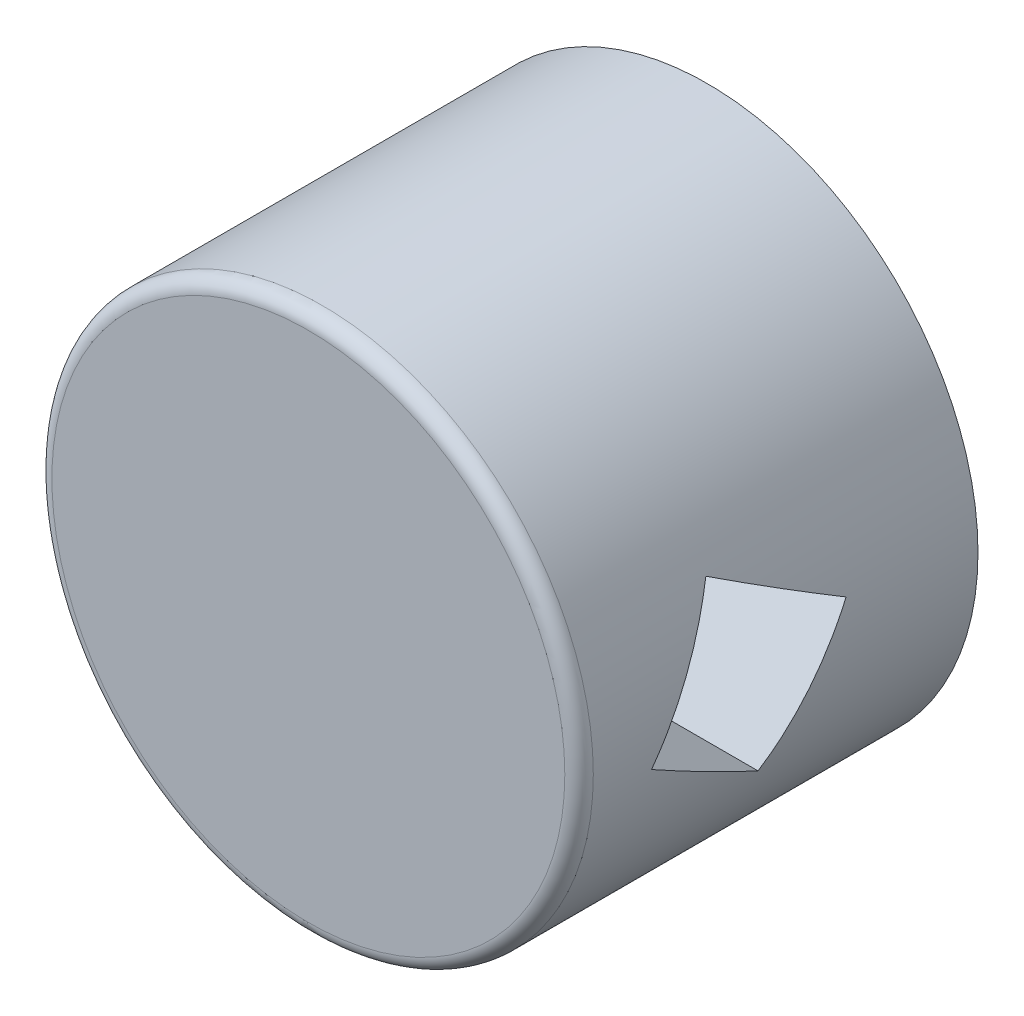
ISO-10303-21;
HEADER;
FILE_DESCRIPTION(('STEP AP214'),'2;1');
FILE_NAME('part.step','',(''),(''),'','','');
FILE_SCHEMA(('AUTOMOTIVE_DESIGN { 1 0 10303 214 1 1 1 1 }'));
ENDSEC;
DATA;
#1=APPLICATION_CONTEXT('core data for automotive mechanical design processes');
#2=APPLICATION_PROTOCOL_DEFINITION('international standard','automotive_design',2000,#1);
#3=PRODUCT_CONTEXT('',#1,'mechanical');
#4=PRODUCT('Part','Part','',(#3));
#5=PRODUCT_RELATED_PRODUCT_CATEGORY('part','',(#4));
#6=PRODUCT_DEFINITION_FORMATION('','',#4);
#7=PRODUCT_DEFINITION_CONTEXT('part definition',#1,'design');
#8=PRODUCT_DEFINITION('design','',#6,#7);
#9=PRODUCT_DEFINITION_SHAPE('','',#8);
#10=(LENGTH_UNIT() NAMED_UNIT(*) SI_UNIT(.MILLI.,.METRE.));
#11=(NAMED_UNIT(*) PLANE_ANGLE_UNIT() SI_UNIT($,.RADIAN.));
#12=(NAMED_UNIT(*) SI_UNIT($,.STERADIAN.) SOLID_ANGLE_UNIT());
#13=UNCERTAINTY_MEASURE_WITH_UNIT(LENGTH_MEASURE(1.E-05),#10,'distance_accuracy_value','');
#14=(GEOMETRIC_REPRESENTATION_CONTEXT(3) GLOBAL_UNCERTAINTY_ASSIGNED_CONTEXT((#13)) GLOBAL_UNIT_ASSIGNED_CONTEXT((#10,
#11,#12)) REPRESENTATION_CONTEXT('',''));
#15=CARTESIAN_POINT('',(0.,0.,0.));
#16=DIRECTION('',(0.,0.,1.));
#17=DIRECTION('',(1.,0.,0.));
#18=AXIS2_PLACEMENT_3D('',#15,#16,#17);
#19=CARTESIAN_POINT('',(0.,0.,70.));
#20=DIRECTION('',(0.,0.,-1.));
#21=DIRECTION('',(-1.,0.,0.));
#22=AXIS2_PLACEMENT_3D('',#19,#20,#21);
#23=CYLINDRICAL_SURFACE('',#22,95.);
#24=CARTESIAN_POINT('',(0.,0.,-40.0000000000002));
#25=DIRECTION('',(0.,0.866025403784442,-0.499999999999995));
#26=DIRECTION('',(0.,-0.499999999999995,-0.866025403784442));
#27=AXIS2_PLACEMENT_3D('',#24,#25,#26);
#28=ELLIPSE('',#27,190.000000000002,95.);
#29=CARTESIAN_POINT('',(-94.5582671021698,9.1506350946107,-24.1506350946114));
#30=VERTEX_POINT('',#29);
#31=CARTESIAN_POINT('',(-88.6495015363018,34.1506350946104,19.1506350946106));
#32=VERTEX_POINT('',#31);
#33=EDGE_CURVE('E11',#30,#32,#28,.T.);
#34=ORIENTED_EDGE('',*,*,#33,.T.);
#35=CARTESIAN_POINT('',(0.,0.,38.8675134594804));
#36=DIRECTION('',(0.,0.499999999999995,0.866025403784442));
#37=DIRECTION('',(0.,0.866025403784442,-0.499999999999995));
#38=AXIS2_PLACEMENT_3D('',#35,#36,#37);
#39=ELLIPSE('',#38,109.696551146029,95.);
#40=CARTESIAN_POINT('',(-94.5582671021697,-9.15063509461164,44.1506350946104));
#41=VERTEX_POINT('',#40);
#42=EDGE_CURVE('E52',#32,#41,#39,.T.);
#43=ORIENTED_EDGE('',*,*,#42,.T.);
#44=CARTESIAN_POINT('',(0.,0.,60.0000000000008));
#45=DIRECTION('',(0.,-0.866025403784442,0.499999999999995));
#46=DIRECTION('',(0.,-0.499999999999995,-0.866025403784442));
#47=AXIS2_PLACEMENT_3D('',#44,#45,#46);
#48=ELLIPSE('',#47,190.000000000002,95.);
#49=CARTESIAN_POINT('',(-88.6495015363014,-34.1506350946114,0.849364905388301));
#50=VERTEX_POINT('',#49);
#51=EDGE_CURVE('E99',#41,#50,#48,.T.);
#52=ORIENTED_EDGE('',*,*,#51,.T.);
#53=CARTESIAN_POINT('',(0.,0.,-18.867513459482));
#54=DIRECTION('',(0.,-0.499999999999995,-0.866025403784442));
#55=DIRECTION('',(0.,0.866025403784442,-0.499999999999995));
#56=AXIS2_PLACEMENT_3D('',#53,#54,#55);
#57=ELLIPSE('',#56,109.696551146029,95.);
#58=EDGE_CURVE('E44',#50,#30,#57,.T.);
#59=ORIENTED_EDGE('',*,*,#58,.T.);
#60=EDGE_LOOP('',(#34,#43,#52,#59));
#61=FACE_BOUND('',#60,.T.);
#62=CARTESIAN_POINT('',(88.6495015363013,-34.1506350946114,0.849364905388301));
#63=VERTEX_POINT('',#62);
#64=CARTESIAN_POINT('',(94.5582671021697,-9.15063509461164,44.1506350946104));
#65=VERTEX_POINT('',#64);
#66=EDGE_CURVE('E39',#63,#65,#48,.T.);
#67=ORIENTED_EDGE('',*,*,#66,.T.);
#68=CARTESIAN_POINT('',(88.6495015363017,34.1506350946104,19.1506350946106));
#69=VERTEX_POINT('',#68);
#70=EDGE_CURVE('E87',#65,#69,#39,.T.);
#71=ORIENTED_EDGE('',*,*,#70,.T.);
#72=CARTESIAN_POINT('',(94.5582671021697,9.1506350946107,-24.1506350946114));
#73=VERTEX_POINT('',#72);
#74=EDGE_CURVE('E45',#69,#73,#28,.T.);
#75=ORIENTED_EDGE('',*,*,#74,.T.);
#76=EDGE_CURVE('E60',#73,#63,#57,.T.);
#77=ORIENTED_EDGE('',*,*,#76,.T.);
#78=EDGE_LOOP('',(#67,#71,#75,#77));
#79=FACE_BOUND('',#78,.T.);
#80=CARTESIAN_POINT('',(0.,0.,65.));
#81=DIRECTION('',(0.,0.,1.));
#82=DIRECTION('',(1.,0.,0.));
#83=AXIS2_PLACEMENT_3D('',#80,#81,#82);
#84=CIRCLE('',#83,95.);
#85=CARTESIAN_POINT('',(95.,0.,65.));
#86=VERTEX_POINT('',#85);
#87=EDGE_CURVE('E93',#86,#86,#84,.F.);
#88=ORIENTED_EDGE('',*,*,#87,.T.);
#89=EDGE_LOOP('',(#88));
#90=FACE_BOUND('',#89,.T.);
#91=CARTESIAN_POINT('',(0.,0.,-70.));
#92=DIRECTION('',(0.,0.,1.));
#93=DIRECTION('',(1.,0.,0.));
#94=AXIS2_PLACEMENT_3D('',#91,#92,#93);
#95=CIRCLE('',#94,95.);
#96=CARTESIAN_POINT('',(95.,0.,-70.));
#97=VERTEX_POINT('',#96);
#98=EDGE_CURVE('E124',#97,#97,#95,.T.);
#99=ORIENTED_EDGE('',*,*,#98,.T.);
#100=EDGE_LOOP('',(#99));
#101=FACE_BOUND('',#100,.T.);
#102=ADVANCED_FACE('F35',(#61,#79,#90,#101),#23,.T.);
#103=CARTESIAN_POINT('',(0.,0.,70.));
#104=DIRECTION('',(0.,0.,1.));
#105=DIRECTION('',(1.,0.,0.));
#106=AXIS2_PLACEMENT_3D('',#103,#104,#105);
#107=PLANE('',#106);
#108=CARTESIAN_POINT('',(0.,0.,70.));
#109=DIRECTION('',(0.,0.,1.));
#110=DIRECTION('',(1.,0.,0.));
#111=AXIS2_PLACEMENT_3D('',#108,#109,#110);
#112=CIRCLE('',#111,90.);
#113=CARTESIAN_POINT('',(90.,0.,70.));
#114=VERTEX_POINT('',#113);
#115=EDGE_CURVE('E97',#114,#114,#112,.T.);
#116=ORIENTED_EDGE('',*,*,#115,.T.);
#117=EDGE_LOOP('',(#116));
#118=FACE_BOUND('',#117,.T.);
#119=ADVANCED_FACE('F130',(#118),#107,.T.);
#120=CARTESIAN_POINT('',(0.,0.,-70.));
#121=DIRECTION('',(0.,0.,1.));
#122=DIRECTION('',(1.,0.,0.));
#123=AXIS2_PLACEMENT_3D('',#120,#121,#122);
#124=PLANE('',#123);
#125=CARTESIAN_POINT('',(0.,0.,-70.));
#126=DIRECTION('',(0.,0.,-1.));
#127=DIRECTION('',(-1.,0.,0.));
#128=AXIS2_PLACEMENT_3D('',#125,#126,#127);
#129=CIRCLE('',#128,80.);
#130=CARTESIAN_POINT('',(-80.,0.,-70.));
#131=VERTEX_POINT('',#130);
#132=EDGE_CURVE('E121',#131,#131,#129,.T.);
#133=ORIENTED_EDGE('',*,*,#132,.F.);
#134=EDGE_LOOP('',(#133));
#135=FACE_BOUND('',#134,.T.);
#136=ORIENTED_EDGE('',*,*,#98,.F.);
#137=EDGE_LOOP('',(#136));
#138=FACE_BOUND('',#137,.T.);
#139=ADVANCED_FACE('F148',(#135,#138),#124,.F.);
#140=CARTESIAN_POINT('',(0.,0.,-50.));
#141=DIRECTION('',(0.,0.,-1.));
#142=DIRECTION('',(-1.,0.,0.));
#143=AXIS2_PLACEMENT_3D('',#140,#141,#142);
#144=CYLINDRICAL_SURFACE('',#143,80.);
#145=CARTESIAN_POINT('',(0.,0.,-50.));
#146=DIRECTION('',(0.,0.,-1.));
#147=DIRECTION('',(-1.,0.,0.));
#148=AXIS2_PLACEMENT_3D('',#145,#146,#147);
#149=CIRCLE('',#148,80.);
#150=CARTESIAN_POINT('',(-80.,0.,-50.));
#151=VERTEX_POINT('',#150);
#152=EDGE_CURVE('E117',#151,#151,#149,.F.);
#153=ORIENTED_EDGE('',*,*,#152,.T.);
#154=EDGE_LOOP('',(#153));
#155=FACE_BOUND('',#154,.T.);
#156=ORIENTED_EDGE('',*,*,#132,.T.);
#157=EDGE_LOOP('',(#156));
#158=FACE_BOUND('',#157,.T.);
#159=ADVANCED_FACE('F152',(#155,#158),#144,.F.);
#160=CARTESIAN_POINT('',(0.,0.,-50.));
#161=DIRECTION('',(0.,0.,-1.));
#162=DIRECTION('',(-1.,0.,0.));
#163=AXIS2_PLACEMENT_3D('',#160,#161,#162);
#164=PLANE('',#163);
#165=CARTESIAN_POINT('',(0.,0.,-50.));
#166=DIRECTION('',(0.,0.,-1.));
#167=DIRECTION('',(-1.,0.,0.));
#168=AXIS2_PLACEMENT_3D('',#165,#166,#167);
#169=CIRCLE('',#168,85.);
#170=CARTESIAN_POINT('',(-85.,0.,-50.));
#171=VERTEX_POINT('',#170);
#172=EDGE_CURVE('E108',#171,#171,#169,.T.);
#173=ORIENTED_EDGE('',*,*,#172,.F.);
#174=EDGE_LOOP('',(#173));
#175=FACE_BOUND('',#174,.T.);
#176=ORIENTED_EDGE('',*,*,#152,.F.);
#177=EDGE_LOOP('',(#176));
#178=FACE_BOUND('',#177,.T.);
#179=ADVANCED_FACE('F157',(#175,#178),#164,.F.);
#180=CARTESIAN_POINT('',(0.,0.,-40.));
#181=DIRECTION('',(0.,0.,-1.));
#182=DIRECTION('',(-1.,0.,0.));
#183=AXIS2_PLACEMENT_3D('',#180,#181,#182);
#184=CYLINDRICAL_SURFACE('',#183,85.);
#185=CARTESIAN_POINT('',(0.,0.,-40.));
#186=DIRECTION('',(0.,0.,-1.));
#187=DIRECTION('',(-1.,0.,0.));
#188=AXIS2_PLACEMENT_3D('',#185,#186,#187);
#189=CIRCLE('',#188,85.);
#190=CARTESIAN_POINT('',(-85.,0.,-40.));
#191=VERTEX_POINT('',#190);
#192=EDGE_CURVE('E111',#191,#191,#189,.T.);
#193=ORIENTED_EDGE('',*,*,#192,.F.);
#194=EDGE_LOOP('',(#193));
#195=FACE_BOUND('',#194,.T.);
#196=ORIENTED_EDGE('',*,*,#172,.T.);
#197=EDGE_LOOP('',(#196));
#198=FACE_BOUND('',#197,.T.);
#199=ADVANCED_FACE('F140',(#195,#198),#184,.F.);
#200=CARTESIAN_POINT('',(0.,0.,-40.));
#201=DIRECTION('',(0.,0.,-1.));
#202=DIRECTION('',(-1.,0.,0.));
#203=AXIS2_PLACEMENT_3D('',#200,#201,#202);
#204=PLANE('',#203);
#205=ORIENTED_EDGE('',*,*,#192,.T.);
#206=EDGE_LOOP('',(#205));
#207=FACE_BOUND('',#206,.T.);
#208=ADVANCED_FACE('F133',(#207),#204,.T.);
#209=CARTESIAN_POINT('',(0.,0.,65.));
#210=DIRECTION('',(0.,0.,1.));
#211=DIRECTION('',(1.,0.,0.));
#212=AXIS2_PLACEMENT_3D('',#209,#210,#211);
#213=TOROIDAL_SURFACE('',#212,90.,5.);
#214=ORIENTED_EDGE('',*,*,#87,.F.);
#215=EDGE_LOOP('',(#214));
#216=FACE_BOUND('',#215,.T.);
#217=ORIENTED_EDGE('',*,*,#115,.F.);
#218=EDGE_LOOP('',(#217));
#219=FACE_BOUND('',#218,.T.);
#220=ADVANCED_FACE('F37',(#216,#219),#213,.T.);
#221=CARTESIAN_POINT('',(-95.,9.1506350946107,-24.1506350946114));
#222=DIRECTION('',(0.,-0.499999999999995,-0.866025403784442));
#223=DIRECTION('',(0.,0.866025403784442,-0.499999999999995));
#224=AXIS2_PLACEMENT_3D('',#221,#222,#223);
#225=PLANE('',#224);
#226=DIRECTION('',(1.,0.,0.));
#227=VECTOR('',#226,1.);
#228=CARTESIAN_POINT('',(-95.,9.1506350946107,-24.1506350946114));
#229=LINE('',#228,#227);
#230=EDGE_CURVE('E83',#30,#73,#229,.T.);
#231=ORIENTED_EDGE('',*,*,#230,.F.);
#232=ORIENTED_EDGE('',*,*,#58,.F.);
#233=DIRECTION('',(1.,0.,0.));
#234=VECTOR('',#233,1.);
#235=CARTESIAN_POINT('',(-95.,-34.1506350946114,0.849364905388301));
#236=LINE('',#235,#234);
#237=EDGE_CURVE('E105',#50,#63,#236,.T.);
#238=ORIENTED_EDGE('',*,*,#237,.T.);
#239=ORIENTED_EDGE('',*,*,#76,.F.);
#240=EDGE_LOOP('',(#231,#232,#238,#239));
#241=FACE_BOUND('',#240,.T.);
#242=ADVANCED_FACE('F104',(#241),#225,.F.);
#243=CARTESIAN_POINT('',(-95.,-34.1506350946114,0.849364905388301));
#244=DIRECTION('',(0.,-0.866025403784442,0.499999999999995));
#245=DIRECTION('',(0.,-0.499999999999995,-0.866025403784442));
#246=AXIS2_PLACEMENT_3D('',#243,#244,#245);
#247=PLANE('',#246);
#248=ORIENTED_EDGE('',*,*,#237,.F.);
#249=ORIENTED_EDGE('',*,*,#51,.F.);
#250=DIRECTION('',(1.,0.,0.));
#251=VECTOR('',#250,1.);
#252=CARTESIAN_POINT('',(-95.,-9.15063509461164,44.1506350946104));
#253=LINE('',#252,#251);
#254=EDGE_CURVE('E89',#41,#65,#253,.T.);
#255=ORIENTED_EDGE('',*,*,#254,.T.);
#256=ORIENTED_EDGE('',*,*,#66,.F.);
#257=EDGE_LOOP('',(#248,#249,#255,#256));
#258=FACE_BOUND('',#257,.T.);
#259=ADVANCED_FACE('F107',(#258),#247,.F.);
#260=CARTESIAN_POINT('',(-95.,34.1506350946104,19.1506350946106));
#261=DIRECTION('',(0.,0.499999999999995,0.866025403784442));
#262=DIRECTION('',(0.,-0.866025403784442,0.499999999999995));
#263=AXIS2_PLACEMENT_3D('',#260,#261,#262);
#264=PLANE('',#263);
#265=DIRECTION('',(1.,0.,0.));
#266=VECTOR('',#265,1.);
#267=CARTESIAN_POINT('',(-95.,34.1506350946104,19.1506350946106));
#268=LINE('',#267,#266);
#269=EDGE_CURVE('E82',#32,#69,#268,.T.);
#270=ORIENTED_EDGE('',*,*,#269,.T.);
#271=ORIENTED_EDGE('',*,*,#70,.F.);
#272=ORIENTED_EDGE('',*,*,#254,.F.);
#273=ORIENTED_EDGE('',*,*,#42,.F.);
#274=EDGE_LOOP('',(#270,#271,#272,#273));
#275=FACE_BOUND('',#274,.T.);
#276=ADVANCED_FACE('F86',(#275),#264,.F.);
#277=CARTESIAN_POINT('',(-95.,9.1506350946107,-24.1506350946114));
#278=DIRECTION('',(0.,0.866025403784442,-0.499999999999995));
#279=DIRECTION('',(0.,0.499999999999995,0.866025403784442));
#280=AXIS2_PLACEMENT_3D('',#277,#278,#279);
#281=PLANE('',#280);
#282=ORIENTED_EDGE('',*,*,#230,.T.);
#283=ORIENTED_EDGE('',*,*,#74,.F.);
#284=ORIENTED_EDGE('',*,*,#269,.F.);
#285=ORIENTED_EDGE('',*,*,#33,.F.);
#286=EDGE_LOOP('',(#282,#283,#284,#285));
#287=FACE_BOUND('',#286,.T.);
#288=ADVANCED_FACE('F81',(#287),#281,.F.);
#289=CLOSED_SHELL('',(#102,#119,#139,#159,#179,#199,#208,#220,#242,#259,#276,#288));
#290=MANIFOLD_SOLID_BREP('B2',#289);
#291=ADVANCED_BREP_SHAPE_REPRESENTATION('',(#18,#290),#14);
#292=SHAPE_DEFINITION_REPRESENTATION(#9,#291);
ENDSEC;
END-ISO-10303-21;
